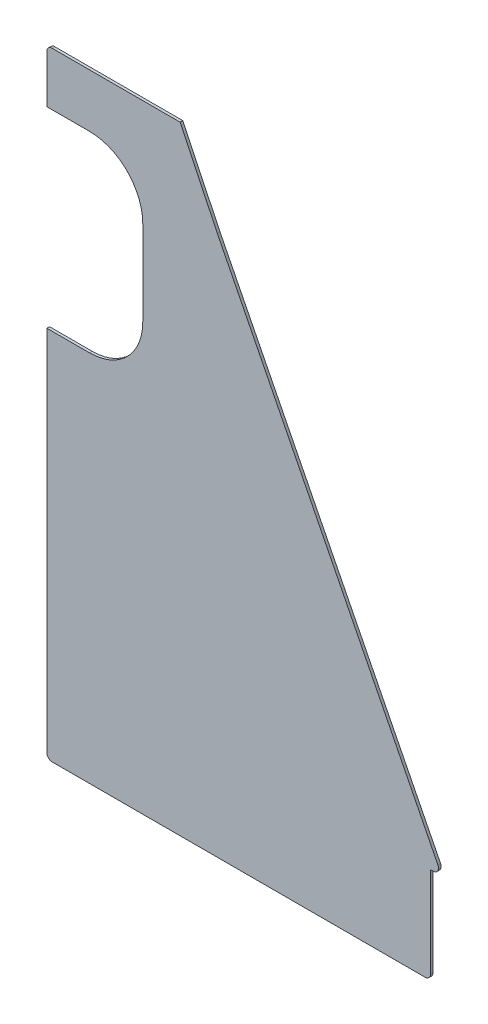
ISO-10303-21;
HEADER;
FILE_DESCRIPTION(('STEP AP214'),'2;1');
FILE_NAME('part.step','',(''),(''),'','','');
FILE_SCHEMA(('AUTOMOTIVE_DESIGN { 1 0 10303 214 1 1 1 1 }'));
ENDSEC;
DATA;
#1=APPLICATION_CONTEXT('core data for automotive mechanical design processes');
#2=APPLICATION_PROTOCOL_DEFINITION('international standard','automotive_design',2000,#1);
#3=PRODUCT_CONTEXT('',#1,'mechanical');
#4=PRODUCT('Part','Part','',(#3));
#5=PRODUCT_RELATED_PRODUCT_CATEGORY('part','',(#4));
#6=PRODUCT_DEFINITION_FORMATION('','',#4);
#7=PRODUCT_DEFINITION_CONTEXT('part definition',#1,'design');
#8=PRODUCT_DEFINITION('design','',#6,#7);
#9=PRODUCT_DEFINITION_SHAPE('','',#8);
#10=(LENGTH_UNIT() NAMED_UNIT(*) SI_UNIT(.MILLI.,.METRE.));
#11=(NAMED_UNIT(*) PLANE_ANGLE_UNIT() SI_UNIT($,.RADIAN.));
#12=(NAMED_UNIT(*) SI_UNIT($,.STERADIAN.) SOLID_ANGLE_UNIT());
#13=UNCERTAINTY_MEASURE_WITH_UNIT(LENGTH_MEASURE(1.E-05),#10,'distance_accuracy_value','');
#14=(GEOMETRIC_REPRESENTATION_CONTEXT(3) GLOBAL_UNCERTAINTY_ASSIGNED_CONTEXT((#13)) GLOBAL_UNIT_ASSIGNED_CONTEXT((#10,
#11,#12)) REPRESENTATION_CONTEXT('',''));
#15=CARTESIAN_POINT('',(0.,0.,0.));
#16=DIRECTION('',(0.,0.,1.));
#17=DIRECTION('',(1.,0.,0.));
#18=AXIS2_PLACEMENT_3D('',#15,#16,#17);
#19=CARTESIAN_POINT('',(-360.,-580.,5.));
#20=DIRECTION('',(1.,0.,0.));
#21=DIRECTION('',(0.,0.,-1.));
#22=AXIS2_PLACEMENT_3D('',#19,#20,#21);
#23=PLANE('',#22);
#24=DIRECTION('',(0.,-1.,0.));
#25=VECTOR('',#24,1.);
#26=CARTESIAN_POINT('',(-360.,-580.,5.));
#27=LINE('',#26,#25);
#28=CARTESIAN_POINT('',(-360.,120.,5.));
#29=VERTEX_POINT('',#28);
#30=CARTESIAN_POINT('',(-360.,-570.,5.));
#31=VERTEX_POINT('',#30);
#32=EDGE_CURVE('E279',#29,#31,#27,.T.);
#33=ORIENTED_EDGE('',*,*,#32,.F.);
#34=DIRECTION('',(0.,0.,-1.));
#35=VECTOR('',#34,1.);
#36=CARTESIAN_POINT('',(-360.,120.,5.));
#37=LINE('',#36,#35);
#38=CARTESIAN_POINT('',(-360.,120.,0.));
#39=VERTEX_POINT('',#38);
#40=EDGE_CURVE('E272',#29,#39,#37,.T.);
#41=ORIENTED_EDGE('',*,*,#40,.T.);
#42=DIRECTION('',(0.,-1.,0.));
#43=VECTOR('',#42,1.);
#44=CARTESIAN_POINT('',(-360.,-580.,0.));
#45=LINE('',#44,#43);
#46=CARTESIAN_POINT('',(-360.,-570.,0.));
#47=VERTEX_POINT('',#46);
#48=EDGE_CURVE('E172',#39,#47,#45,.T.);
#49=ORIENTED_EDGE('',*,*,#48,.T.);
#50=DIRECTION('',(0.,0.,-1.));
#51=VECTOR('',#50,1.);
#52=CARTESIAN_POINT('',(-360.,-570.,5.));
#53=LINE('',#52,#51);
#54=EDGE_CURVE('E203',#47,#31,#53,.F.);
#55=ORIENTED_EDGE('',*,*,#54,.T.);
#56=EDGE_LOOP('',(#33,#41,#49,#55));
#57=FACE_BOUND('',#56,.T.);
#58=ADVANCED_FACE('F33',(#57),#23,.F.);
#59=CARTESIAN_POINT('',(360.,-580.,5.));
#60=DIRECTION('',(-1.,0.,0.));
#61=DIRECTION('',(0.,0.,1.));
#62=AXIS2_PLACEMENT_3D('',#59,#60,#61);
#63=PLANE('',#62);
#64=DIRECTION('',(0.,1.,0.));
#65=VECTOR('',#64,1.);
#66=CARTESIAN_POINT('',(360.,-580.,0.));
#67=LINE('',#66,#65);
#68=CARTESIAN_POINT('',(360.,-570.,0.));
#69=VERTEX_POINT('',#68);
#70=CARTESIAN_POINT('',(360.,-400.000000000001,0.));
#71=VERTEX_POINT('',#70);
#72=EDGE_CURVE('E152',#69,#71,#67,.T.);
#73=ORIENTED_EDGE('',*,*,#72,.T.);
#74=DIRECTION('',(0.,0.,-1.));
#75=VECTOR('',#74,1.);
#76=CARTESIAN_POINT('',(360.,-400.,5.));
#77=LINE('',#76,#75);
#78=CARTESIAN_POINT('',(360.,-400.000000000001,5.));
#79=VERTEX_POINT('',#78);
#80=EDGE_CURVE('E157',#79,#71,#77,.T.);
#81=ORIENTED_EDGE('',*,*,#80,.F.);
#82=DIRECTION('',(0.,1.,0.));
#83=VECTOR('',#82,1.);
#84=CARTESIAN_POINT('',(360.,-580.,5.));
#85=LINE('',#84,#83);
#86=CARTESIAN_POINT('',(360.,-570.,5.));
#87=VERTEX_POINT('',#86);
#88=EDGE_CURVE('E186',#87,#79,#85,.T.);
#89=ORIENTED_EDGE('',*,*,#88,.F.);
#90=DIRECTION('',(0.,0.,-1.));
#91=VECTOR('',#90,1.);
#92=CARTESIAN_POINT('',(360.,-570.,5.));
#93=LINE('',#92,#91);
#94=EDGE_CURVE('E169',#87,#69,#93,.T.);
#95=ORIENTED_EDGE('',*,*,#94,.T.);
#96=EDGE_LOOP('',(#73,#81,#89,#95));
#97=FACE_BOUND('',#96,.T.);
#98=ADVANCED_FACE('F167',(#97),#63,.F.);
#99=CARTESIAN_POINT('',(-360.,580.,5.));
#100=DIRECTION('',(0.,-1.,0.));
#101=DIRECTION('',(0.,0.,-1.));
#102=AXIS2_PLACEMENT_3D('',#99,#100,#101);
#103=PLANE('',#102);
#104=DIRECTION('',(-1.,0.,0.));
#105=VECTOR('',#104,1.);
#106=CARTESIAN_POINT('',(-360.,580.,5.));
#107=LINE('',#106,#105);
#108=CARTESIAN_POINT('',(-110.,580.,5.));
#109=VERTEX_POINT('',#108);
#110=CARTESIAN_POINT('',(-350.,580.,5.));
#111=VERTEX_POINT('',#110);
#112=EDGE_CURVE('E278',#109,#111,#107,.T.);
#113=ORIENTED_EDGE('',*,*,#112,.F.);
#114=DIRECTION('',(0.,0.,-1.));
#115=VECTOR('',#114,1.);
#116=CARTESIAN_POINT('',(-110.,580.,5.));
#117=LINE('',#116,#115);
#118=CARTESIAN_POINT('',(-110.,580.,0.));
#119=VERTEX_POINT('',#118);
#120=EDGE_CURVE('E163',#109,#119,#117,.T.);
#121=ORIENTED_EDGE('',*,*,#120,.T.);
#122=DIRECTION('',(-1.,0.,0.));
#123=VECTOR('',#122,1.);
#124=CARTESIAN_POINT('',(-360.,580.,0.));
#125=LINE('',#124,#123);
#126=CARTESIAN_POINT('',(-350.,580.,0.));
#127=VERTEX_POINT('',#126);
#128=EDGE_CURVE('E170',#119,#127,#125,.T.);
#129=ORIENTED_EDGE('',*,*,#128,.T.);
#130=DIRECTION('',(0.,0.,-1.));
#131=VECTOR('',#130,1.);
#132=CARTESIAN_POINT('',(-350.,580.,5.));
#133=LINE('',#132,#131);
#134=EDGE_CURVE('E213',#127,#111,#133,.F.);
#135=ORIENTED_EDGE('',*,*,#134,.T.);
#136=EDGE_LOOP('',(#113,#121,#129,#135));
#137=FACE_BOUND('',#136,.T.);
#138=ADVANCED_FACE('F316',(#137),#103,.F.);
#139=CARTESIAN_POINT('',(-360.,570.,0.));
#140=VERTEX_POINT('',#139);
#141=CARTESIAN_POINT('',(-360.,480.,0.));
#142=VERTEX_POINT('',#141);
#143=EDGE_CURVE('E180',#140,#142,#45,.T.);
#144=ORIENTED_EDGE('',*,*,#143,.T.);
#145=DIRECTION('',(0.,0.,1.));
#146=VECTOR('',#145,1.);
#147=CARTESIAN_POINT('',(-360.,480.,5.));
#148=LINE('',#147,#146);
#149=CARTESIAN_POINT('',(-360.,480.,5.));
#150=VERTEX_POINT('',#149);
#151=EDGE_CURVE('E263',#142,#150,#148,.T.);
#152=ORIENTED_EDGE('',*,*,#151,.T.);
#153=CARTESIAN_POINT('',(-360.,570.,5.));
#154=VERTEX_POINT('',#153);
#155=EDGE_CURVE('E280',#154,#150,#27,.T.);
#156=ORIENTED_EDGE('',*,*,#155,.F.);
#157=DIRECTION('',(0.,0.,-1.));
#158=VECTOR('',#157,1.);
#159=CARTESIAN_POINT('',(-360.,570.,5.));
#160=LINE('',#159,#158);
#161=EDGE_CURVE('E200',#154,#140,#160,.T.);
#162=ORIENTED_EDGE('',*,*,#161,.T.);
#163=EDGE_LOOP('',(#144,#152,#156,#162));
#164=FACE_BOUND('',#163,.T.);
#165=ADVANCED_FACE('F311',(#164),#23,.F.);
#166=CARTESIAN_POINT('',(-360.,-580.,5.));
#167=DIRECTION('',(0.,1.,0.));
#168=DIRECTION('',(0.,0.,1.));
#169=AXIS2_PLACEMENT_3D('',#166,#167,#168);
#170=PLANE('',#169);
#171=DIRECTION('',(1.,0.,0.));
#172=VECTOR('',#171,1.);
#173=CARTESIAN_POINT('',(-360.,-580.,5.));
#174=LINE('',#173,#172);
#175=CARTESIAN_POINT('',(-350.,-580.,5.));
#176=VERTEX_POINT('',#175);
#177=CARTESIAN_POINT('',(350.,-580.,5.));
#178=VERTEX_POINT('',#177);
#179=EDGE_CURVE('E177',#176,#178,#174,.T.);
#180=ORIENTED_EDGE('',*,*,#179,.F.);
#181=DIRECTION('',(0.,0.,-1.));
#182=VECTOR('',#181,1.);
#183=CARTESIAN_POINT('',(-350.,-580.,5.));
#184=LINE('',#183,#182);
#185=CARTESIAN_POINT('',(-350.,-580.,0.));
#186=VERTEX_POINT('',#185);
#187=EDGE_CURVE('E189',#176,#186,#184,.T.);
#188=ORIENTED_EDGE('',*,*,#187,.T.);
#189=DIRECTION('',(1.,0.,0.));
#190=VECTOR('',#189,1.);
#191=CARTESIAN_POINT('',(-360.,-580.,0.));
#192=LINE('',#191,#190);
#193=CARTESIAN_POINT('',(350.,-580.,0.));
#194=VERTEX_POINT('',#193);
#195=EDGE_CURVE('E183',#186,#194,#192,.T.);
#196=ORIENTED_EDGE('',*,*,#195,.T.);
#197=DIRECTION('',(0.,0.,-1.));
#198=VECTOR('',#197,1.);
#199=CARTESIAN_POINT('',(350.,-580.,5.));
#200=LINE('',#199,#198);
#201=EDGE_CURVE('E187',#194,#178,#200,.F.);
#202=ORIENTED_EDGE('',*,*,#201,.T.);
#203=EDGE_LOOP('',(#180,#188,#196,#202));
#204=FACE_BOUND('',#203,.T.);
#205=ADVANCED_FACE('F299',(#204),#170,.F.);
#206=CARTESIAN_POINT('',(0.,0.,5.));
#207=DIRECTION('',(0.,0.,-1.));
#208=DIRECTION('',(-1.,0.,0.));
#209=AXIS2_PLACEMENT_3D('',#206,#207,#208);
#210=PLANE('',#209);
#211=DIRECTION('',(1.,0.,0.));
#212=VECTOR('',#211,1.);
#213=CARTESIAN_POINT('',(360.,-400.000000000001,5.));
#214=LINE('',#213,#212);
#215=CARTESIAN_POINT('',(365.044471212295,-400.000000000001,5.));
#216=VERTEX_POINT('',#215);
#217=EDGE_CURVE('E159',#79,#216,#214,.T.);
#218=ORIENTED_EDGE('',*,*,#217,.T.);
#219=CARTESIAN_POINT('',(365.044471212295,-390.000000000001,5.));
#220=DIRECTION('',(0.,0.,-1.));
#221=DIRECTION('',(-1.,0.,0.));
#222=AXIS2_PLACEMENT_3D('',#219,#220,#221);
#223=CIRCLE('',#222,10.);
#224=CARTESIAN_POINT('',(373.970329396816,-385.491224593107,5.));
#225=VERTEX_POINT('',#224);
#226=EDGE_CURVE('E11',#216,#225,#223,.F.);
#227=ORIENTED_EDGE('',*,*,#226,.T.);
#228=DIRECTION('',(-0.450877540689435,0.892585818452124,0.));
#229=VECTOR('',#228,1.);
#230=CARTESIAN_POINT('',(381.299239221106,-400.,5.));
#231=LINE('',#230,#229);
#232=CARTESIAN_POINT('',(-39.8879100561256,433.808833734049,5.));
#233=VERTEX_POINT('',#232);
#234=EDGE_CURVE('E245',#225,#233,#231,.T.);
#235=ORIENTED_EDGE('',*,*,#234,.T.);
#236=DIRECTION('',(-0.432431931952827,0.90166658151866,0.));
#237=VECTOR('',#236,1.);
#238=CARTESIAN_POINT('',(360.,-400.,5.));
#239=LINE('',#238,#237);
#240=EDGE_CURVE('E164',#233,#109,#239,.T.);
#241=ORIENTED_EDGE('',*,*,#240,.T.);
#242=ORIENTED_EDGE('',*,*,#112,.T.);
#243=CARTESIAN_POINT('',(-350.,570.,5.));
#244=DIRECTION('',(0.,0.,-1.));
#245=DIRECTION('',(-1.,0.,0.));
#246=AXIS2_PLACEMENT_3D('',#243,#244,#245);
#247=CIRCLE('',#246,10.);
#248=EDGE_CURVE('E206',#111,#154,#247,.F.);
#249=ORIENTED_EDGE('',*,*,#248,.T.);
#250=ORIENTED_EDGE('',*,*,#155,.T.);
#251=DIRECTION('',(-1.,0.,0.));
#252=VECTOR('',#251,1.);
#253=CARTESIAN_POINT('',(-540.,480.,5.));
#254=LINE('',#253,#252);
#255=CARTESIAN_POINT('',(-280.,480.,5.));
#256=VERTEX_POINT('',#255);
#257=EDGE_CURVE('E266',#256,#150,#254,.T.);
#258=ORIENTED_EDGE('',*,*,#257,.F.);
#259=CARTESIAN_POINT('',(-280.,380.,5.));
#260=DIRECTION('',(0.,0.,-1.));
#261=DIRECTION('',(-1.,0.,0.));
#262=AXIS2_PLACEMENT_3D('',#259,#260,#261);
#263=CIRCLE('',#262,100.);
#264=CARTESIAN_POINT('',(-180.,380.,5.));
#265=VERTEX_POINT('',#264);
#266=EDGE_CURVE('E232',#256,#265,#263,.T.);
#267=ORIENTED_EDGE('',*,*,#266,.T.);
#268=DIRECTION('',(0.,1.,0.));
#269=VECTOR('',#268,1.);
#270=CARTESIAN_POINT('',(-180.,120.,5.));
#271=LINE('',#270,#269);
#272=CARTESIAN_POINT('',(-180.,220.,5.));
#273=VERTEX_POINT('',#272);
#274=EDGE_CURVE('E256',#273,#265,#271,.T.);
#275=ORIENTED_EDGE('',*,*,#274,.F.);
#276=CARTESIAN_POINT('',(-280.,220.,5.));
#277=DIRECTION('',(0.,0.,-1.));
#278=DIRECTION('',(-1.,0.,0.));
#279=AXIS2_PLACEMENT_3D('',#276,#277,#278);
#280=CIRCLE('',#279,100.);
#281=CARTESIAN_POINT('',(-280.,120.,5.));
#282=VERTEX_POINT('',#281);
#283=EDGE_CURVE('E228',#273,#282,#280,.T.);
#284=ORIENTED_EDGE('',*,*,#283,.T.);
#285=DIRECTION('',(1.,0.,0.));
#286=VECTOR('',#285,1.);
#287=CARTESIAN_POINT('',(-540.,120.,5.));
#288=LINE('',#287,#286);
#289=EDGE_CURVE('E261',#29,#282,#288,.T.);
#290=ORIENTED_EDGE('',*,*,#289,.F.);
#291=ORIENTED_EDGE('',*,*,#32,.T.);
#292=CARTESIAN_POINT('',(-350.,-570.,5.));
#293=DIRECTION('',(0.,0.,-1.));
#294=DIRECTION('',(-1.,0.,0.));
#295=AXIS2_PLACEMENT_3D('',#292,#293,#294);
#296=CIRCLE('',#295,10.);
#297=EDGE_CURVE('E210',#31,#176,#296,.F.);
#298=ORIENTED_EDGE('',*,*,#297,.T.);
#299=ORIENTED_EDGE('',*,*,#179,.T.);
#300=CARTESIAN_POINT('',(350.,-570.,5.));
#301=DIRECTION('',(0.,0.,-1.));
#302=DIRECTION('',(-1.,0.,0.));
#303=AXIS2_PLACEMENT_3D('',#300,#301,#302);
#304=CIRCLE('',#303,10.);
#305=EDGE_CURVE('E208',#178,#87,#304,.F.);
#306=ORIENTED_EDGE('',*,*,#305,.T.);
#307=ORIENTED_EDGE('',*,*,#88,.T.);
#308=EDGE_LOOP('',(#218,#227,#235,#241,#242,#249,#250,#258,#267,#275,#284,#290,#291,#298,#299,
#306,#307));
#309=FACE_BOUND('',#308,.T.);
#310=ADVANCED_FACE('F288',(#309),#210,.F.);
#311=CARTESIAN_POINT('',(0.,0.,0.));
#312=DIRECTION('',(0.,0.,-1.));
#313=DIRECTION('',(-1.,0.,0.));
#314=AXIS2_PLACEMENT_3D('',#311,#312,#313);
#315=PLANE('',#314);
#316=DIRECTION('',(0.450877540689435,-0.892585818452123,0.));
#317=VECTOR('',#316,1.);
#318=CARTESIAN_POINT('',(381.299239221106,-400.,0.));
#319=LINE('',#318,#317);
#320=CARTESIAN_POINT('',(-39.8879100561256,433.808833734049,0.));
#321=VERTEX_POINT('',#320);
#322=CARTESIAN_POINT('',(373.970329396816,-385.491224593107,0.));
#323=VERTEX_POINT('',#322);
#324=EDGE_CURVE('E154',#321,#323,#319,.T.);
#325=ORIENTED_EDGE('',*,*,#324,.T.);
#326=CARTESIAN_POINT('',(365.044471212295,-390.000000000001,0.));
#327=DIRECTION('',(0.,0.,-1.));
#328=DIRECTION('',(-1.,0.,0.));
#329=AXIS2_PLACEMENT_3D('',#326,#327,#328);
#330=CIRCLE('',#329,10.);
#331=CARTESIAN_POINT('',(365.044471212295,-400.000000000001,0.));
#332=VERTEX_POINT('',#331);
#333=EDGE_CURVE('E55',#323,#332,#330,.T.);
#334=ORIENTED_EDGE('',*,*,#333,.T.);
#335=DIRECTION('',(-1.,0.,0.));
#336=VECTOR('',#335,1.);
#337=CARTESIAN_POINT('',(360.,-400.000000000001,0.));
#338=LINE('',#337,#336);
#339=EDGE_CURVE('E148',#332,#71,#338,.T.);
#340=ORIENTED_EDGE('',*,*,#339,.T.);
#341=ORIENTED_EDGE('',*,*,#72,.F.);
#342=CARTESIAN_POINT('',(350.,-570.,0.));
#343=DIRECTION('',(0.,0.,-1.));
#344=DIRECTION('',(-1.,0.,0.));
#345=AXIS2_PLACEMENT_3D('',#342,#343,#344);
#346=CIRCLE('',#345,10.);
#347=EDGE_CURVE('E195',#69,#194,#346,.T.);
#348=ORIENTED_EDGE('',*,*,#347,.T.);
#349=ORIENTED_EDGE('',*,*,#195,.F.);
#350=CARTESIAN_POINT('',(-350.,-570.,0.));
#351=DIRECTION('',(0.,0.,-1.));
#352=DIRECTION('',(-1.,0.,0.));
#353=AXIS2_PLACEMENT_3D('',#350,#351,#352);
#354=CIRCLE('',#353,10.);
#355=EDGE_CURVE('E197',#186,#47,#354,.T.);
#356=ORIENTED_EDGE('',*,*,#355,.T.);
#357=ORIENTED_EDGE('',*,*,#48,.F.);
#358=DIRECTION('',(-1.,0.,0.));
#359=VECTOR('',#358,1.);
#360=CARTESIAN_POINT('',(0.,120.,0.));
#361=LINE('',#360,#359);
#362=CARTESIAN_POINT('',(-280.,120.,0.));
#363=VERTEX_POINT('',#362);
#364=EDGE_CURVE('E216',#363,#39,#361,.T.);
#365=ORIENTED_EDGE('',*,*,#364,.F.);
#366=CARTESIAN_POINT('',(-280.,220.,0.));
#367=DIRECTION('',(0.,0.,-1.));
#368=DIRECTION('',(-1.,0.,0.));
#369=AXIS2_PLACEMENT_3D('',#366,#367,#368);
#370=CIRCLE('',#369,100.);
#371=CARTESIAN_POINT('',(-180.,220.,0.));
#372=VERTEX_POINT('',#371);
#373=EDGE_CURVE('E230',#363,#372,#370,.F.);
#374=ORIENTED_EDGE('',*,*,#373,.T.);
#375=DIRECTION('',(0.,1.,0.));
#376=VECTOR('',#375,1.);
#377=CARTESIAN_POINT('',(-180.,120.,0.));
#378=LINE('',#377,#376);
#379=CARTESIAN_POINT('',(-180.,380.,0.));
#380=VERTEX_POINT('',#379);
#381=EDGE_CURVE('E257',#372,#380,#378,.T.);
#382=ORIENTED_EDGE('',*,*,#381,.T.);
#383=CARTESIAN_POINT('',(-280.,380.,0.));
#384=DIRECTION('',(0.,0.,-1.));
#385=DIRECTION('',(-1.,0.,0.));
#386=AXIS2_PLACEMENT_3D('',#383,#384,#385);
#387=CIRCLE('',#386,100.);
#388=CARTESIAN_POINT('',(-280.,480.,0.));
#389=VERTEX_POINT('',#388);
#390=EDGE_CURVE('E234',#380,#389,#387,.F.);
#391=ORIENTED_EDGE('',*,*,#390,.T.);
#392=DIRECTION('',(-1.,0.,0.));
#393=VECTOR('',#392,1.);
#394=CARTESIAN_POINT('',(-540.,480.,0.));
#395=LINE('',#394,#393);
#396=EDGE_CURVE('E260',#389,#142,#395,.T.);
#397=ORIENTED_EDGE('',*,*,#396,.T.);
#398=ORIENTED_EDGE('',*,*,#143,.F.);
#399=CARTESIAN_POINT('',(-350.,570.,0.));
#400=DIRECTION('',(0.,0.,-1.));
#401=DIRECTION('',(-1.,0.,0.));
#402=AXIS2_PLACEMENT_3D('',#399,#400,#401);
#403=CIRCLE('',#402,10.);
#404=EDGE_CURVE('E192',#140,#127,#403,.T.);
#405=ORIENTED_EDGE('',*,*,#404,.T.);
#406=ORIENTED_EDGE('',*,*,#128,.F.);
#407=DIRECTION('',(-0.432431931952827,0.90166658151866,0.));
#408=VECTOR('',#407,1.);
#409=CARTESIAN_POINT('',(360.,-400.,0.));
#410=LINE('',#409,#408);
#411=EDGE_CURVE('E250',#321,#119,#410,.T.);
#412=ORIENTED_EDGE('',*,*,#411,.F.);
#413=EDGE_LOOP('',(#325,#334,#340,#341,#348,#349,#356,#357,#365,#374,#382,#391,#397,#398,#405,
#406,#412));
#414=FACE_BOUND('',#413,.T.);
#415=ADVANCED_FACE('F150',(#414),#315,.T.);
#416=CARTESIAN_POINT('',(-350.,-570.,5.));
#417=DIRECTION('',(0.,0.,-1.));
#418=DIRECTION('',(-1.,0.,0.));
#419=AXIS2_PLACEMENT_3D('',#416,#417,#418);
#420=CYLINDRICAL_SURFACE('',#419,10.);
#421=ORIENTED_EDGE('',*,*,#297,.F.);
#422=ORIENTED_EDGE('',*,*,#54,.F.);
#423=ORIENTED_EDGE('',*,*,#355,.F.);
#424=ORIENTED_EDGE('',*,*,#187,.F.);
#425=EDGE_LOOP('',(#421,#422,#423,#424));
#426=FACE_BOUND('',#425,.T.);
#427=ADVANCED_FACE('F296',(#426),#420,.T.);
#428=CARTESIAN_POINT('',(350.,-570.,5.));
#429=DIRECTION('',(0.,0.,-1.));
#430=DIRECTION('',(-1.,0.,0.));
#431=AXIS2_PLACEMENT_3D('',#428,#429,#430);
#432=CYLINDRICAL_SURFACE('',#431,10.);
#433=ORIENTED_EDGE('',*,*,#305,.F.);
#434=ORIENTED_EDGE('',*,*,#201,.F.);
#435=ORIENTED_EDGE('',*,*,#347,.F.);
#436=ORIENTED_EDGE('',*,*,#94,.F.);
#437=EDGE_LOOP('',(#433,#434,#435,#436));
#438=FACE_BOUND('',#437,.T.);
#439=ADVANCED_FACE('F303',(#438),#432,.T.);
#440=CARTESIAN_POINT('',(-350.,570.,5.));
#441=DIRECTION('',(0.,0.,-1.));
#442=DIRECTION('',(-1.,0.,0.));
#443=AXIS2_PLACEMENT_3D('',#440,#441,#442);
#444=CYLINDRICAL_SURFACE('',#443,10.);
#445=ORIENTED_EDGE('',*,*,#248,.F.);
#446=ORIENTED_EDGE('',*,*,#134,.F.);
#447=ORIENTED_EDGE('',*,*,#404,.F.);
#448=ORIENTED_EDGE('',*,*,#161,.F.);
#449=EDGE_LOOP('',(#445,#446,#447,#448));
#450=FACE_BOUND('',#449,.T.);
#451=ADVANCED_FACE('F355',(#450),#444,.T.);
#452=CARTESIAN_POINT('',(360.,-400.,5.));
#453=DIRECTION('',(-0.90166658151866,-0.432431931952827,0.));
#454=DIRECTION('',(0.432431931952827,-0.90166658151866,0.));
#455=AXIS2_PLACEMENT_3D('',#452,#453,#454);
#456=PLANE('',#455);
#457=ORIENTED_EDGE('',*,*,#240,.F.);
#458=DIRECTION('',(0.,0.,-1.));
#459=VECTOR('',#458,1.);
#460=CARTESIAN_POINT('',(-39.8879100561257,433.80883373405,939.14976632723));
#461=LINE('',#460,#459);
#462=EDGE_CURVE('E153',#233,#321,#461,.T.);
#463=ORIENTED_EDGE('',*,*,#462,.T.);
#464=ORIENTED_EDGE('',*,*,#411,.T.);
#465=ORIENTED_EDGE('',*,*,#120,.F.);
#466=EDGE_LOOP('',(#457,#463,#464,#465));
#467=FACE_BOUND('',#466,.T.);
#468=ADVANCED_FACE('F358',(#467),#456,.F.);
#469=CARTESIAN_POINT('',(-540.,120.,0.));
#470=DIRECTION('',(0.,-1.,0.));
#471=DIRECTION('',(0.,0.,-1.));
#472=AXIS2_PLACEMENT_3D('',#469,#470,#471);
#473=PLANE('',#472);
#474=ORIENTED_EDGE('',*,*,#289,.T.);
#475=DIRECTION('',(0.,0.,1.));
#476=VECTOR('',#475,1.);
#477=CARTESIAN_POINT('',(-280.,120.,0.));
#478=LINE('',#477,#476);
#479=EDGE_CURVE('E223',#282,#363,#478,.F.);
#480=ORIENTED_EDGE('',*,*,#479,.T.);
#481=ORIENTED_EDGE('',*,*,#364,.T.);
#482=ORIENTED_EDGE('',*,*,#40,.F.);
#483=EDGE_LOOP('',(#474,#480,#481,#482));
#484=FACE_BOUND('',#483,.T.);
#485=ADVANCED_FACE('F373',(#484),#473,.F.);
#486=CARTESIAN_POINT('',(-540.,480.,0.));
#487=DIRECTION('',(0.,1.,0.));
#488=DIRECTION('',(0.,0.,1.));
#489=AXIS2_PLACEMENT_3D('',#486,#487,#488);
#490=PLANE('',#489);
#491=ORIENTED_EDGE('',*,*,#396,.F.);
#492=DIRECTION('',(0.,0.,1.));
#493=VECTOR('',#492,1.);
#494=CARTESIAN_POINT('',(-280.,480.,5.));
#495=LINE('',#494,#493);
#496=EDGE_CURVE('E225',#389,#256,#495,.T.);
#497=ORIENTED_EDGE('',*,*,#496,.T.);
#498=ORIENTED_EDGE('',*,*,#257,.T.);
#499=ORIENTED_EDGE('',*,*,#151,.F.);
#500=EDGE_LOOP('',(#491,#497,#498,#499));
#501=FACE_BOUND('',#500,.T.);
#502=ADVANCED_FACE('F335',(#501),#490,.F.);
#503=CARTESIAN_POINT('',(-180.,120.,0.));
#504=DIRECTION('',(1.,0.,0.));
#505=DIRECTION('',(0.,0.,-1.));
#506=AXIS2_PLACEMENT_3D('',#503,#504,#505);
#507=PLANE('',#506);
#508=ORIENTED_EDGE('',*,*,#381,.F.);
#509=DIRECTION('',(0.,0.,1.));
#510=VECTOR('',#509,1.);
#511=CARTESIAN_POINT('',(-180.,220.,5.));
#512=LINE('',#511,#510);
#513=EDGE_CURVE('E220',#372,#273,#512,.T.);
#514=ORIENTED_EDGE('',*,*,#513,.T.);
#515=ORIENTED_EDGE('',*,*,#274,.T.);
#516=DIRECTION('',(0.,0.,1.));
#517=VECTOR('',#516,1.);
#518=CARTESIAN_POINT('',(-180.,380.,0.));
#519=LINE('',#518,#517);
#520=EDGE_CURVE('E218',#265,#380,#519,.F.);
#521=ORIENTED_EDGE('',*,*,#520,.T.);
#522=EDGE_LOOP('',(#508,#514,#515,#521));
#523=FACE_BOUND('',#522,.T.);
#524=ADVANCED_FACE('F341',(#523),#507,.F.);
#525=CARTESIAN_POINT('',(-280.,220.,0.));
#526=DIRECTION('',(0.,0.,-1.));
#527=DIRECTION('',(-1.,0.,0.));
#528=AXIS2_PLACEMENT_3D('',#525,#526,#527);
#529=CYLINDRICAL_SURFACE('',#528,100.);
#530=ORIENTED_EDGE('',*,*,#373,.F.);
#531=ORIENTED_EDGE('',*,*,#479,.F.);
#532=ORIENTED_EDGE('',*,*,#283,.F.);
#533=ORIENTED_EDGE('',*,*,#513,.F.);
#534=EDGE_LOOP('',(#530,#531,#532,#533));
#535=FACE_BOUND('',#534,.T.);
#536=ADVANCED_FACE('F345',(#535),#529,.F.);
#537=CARTESIAN_POINT('',(-280.,380.,0.));
#538=DIRECTION('',(0.,0.,-1.));
#539=DIRECTION('',(-1.,0.,0.));
#540=AXIS2_PLACEMENT_3D('',#537,#538,#539);
#541=CYLINDRICAL_SURFACE('',#540,100.);
#542=ORIENTED_EDGE('',*,*,#390,.F.);
#543=ORIENTED_EDGE('',*,*,#520,.F.);
#544=ORIENTED_EDGE('',*,*,#266,.F.);
#545=ORIENTED_EDGE('',*,*,#496,.F.);
#546=EDGE_LOOP('',(#542,#543,#544,#545));
#547=FACE_BOUND('',#546,.T.);
#548=ADVANCED_FACE('F343',(#547),#541,.F.);
#549=CARTESIAN_POINT('',(360.,-400.000000000001,939.14976632723));
#550=DIRECTION('',(0.,-1.,0.));
#551=DIRECTION('',(1.,0.,0.));
#552=AXIS2_PLACEMENT_3D('',#549,#550,#551);
#553=PLANE('',#552);
#554=ORIENTED_EDGE('',*,*,#339,.F.);
#555=DIRECTION('',(0.,0.,-1.));
#556=VECTOR('',#555,1.);
#557=CARTESIAN_POINT('',(365.044471212295,-400.000000000001,939.14976632723));
#558=LINE('',#557,#556);
#559=EDGE_CURVE('E41',#332,#216,#558,.F.);
#560=ORIENTED_EDGE('',*,*,#559,.T.);
#561=ORIENTED_EDGE('',*,*,#217,.F.);
#562=ORIENTED_EDGE('',*,*,#80,.T.);
#563=EDGE_LOOP('',(#554,#560,#561,#562));
#564=FACE_BOUND('',#563,.T.);
#565=ADVANCED_FACE('F158',(#564),#553,.T.);
#566=CARTESIAN_POINT('',(381.299239221106,-400.,939.14976632723));
#567=DIRECTION('',(0.892585818452123,0.450877540689435,0.));
#568=DIRECTION('',(-0.450877540689435,0.892585818452124,0.));
#569=AXIS2_PLACEMENT_3D('',#566,#567,#568);
#570=PLANE('',#569);
#571=ORIENTED_EDGE('',*,*,#234,.F.);
#572=DIRECTION('',(0.,0.,-1.));
#573=VECTOR('',#572,1.);
#574=CARTESIAN_POINT('',(373.970329396816,-385.491224593107,939.14976632723));
#575=LINE('',#574,#573);
#576=EDGE_CURVE('E236',#225,#323,#575,.T.);
#577=ORIENTED_EDGE('',*,*,#576,.T.);
#578=ORIENTED_EDGE('',*,*,#324,.F.);
#579=ORIENTED_EDGE('',*,*,#462,.F.);
#580=EDGE_LOOP('',(#571,#577,#578,#579));
#581=FACE_BOUND('',#580,.T.);
#582=ADVANCED_FACE('F242',(#581),#570,.T.);
#583=CARTESIAN_POINT('',(365.044471212295,-390.000000000001,939.14976632723));
#584=DIRECTION('',(0.,0.,-1.));
#585=DIRECTION('',(-1.,0.,0.));
#586=AXIS2_PLACEMENT_3D('',#583,#584,#585);
#587=CYLINDRICAL_SURFACE('',#586,10.);
#588=ORIENTED_EDGE('',*,*,#226,.F.);
#589=ORIENTED_EDGE('',*,*,#559,.F.);
#590=ORIENTED_EDGE('',*,*,#333,.F.);
#591=ORIENTED_EDGE('',*,*,#576,.F.);
#592=EDGE_LOOP('',(#588,#589,#590,#591));
#593=FACE_BOUND('',#592,.T.);
#594=ADVANCED_FACE('F35',(#593),#587,.T.);
#595=CLOSED_SHELL('',(#58,#98,#138,#165,#205,#310,#415,#427,#439,#451,#468,#485,#502,#524,#536,
#548,#565,#582,#594));
#596=MANIFOLD_SOLID_BREP('B2',#595);
#597=ADVANCED_BREP_SHAPE_REPRESENTATION('',(#18,#596),#14);
#598=SHAPE_DEFINITION_REPRESENTATION(#9,#597);
ENDSEC;
END-ISO-10303-21;
